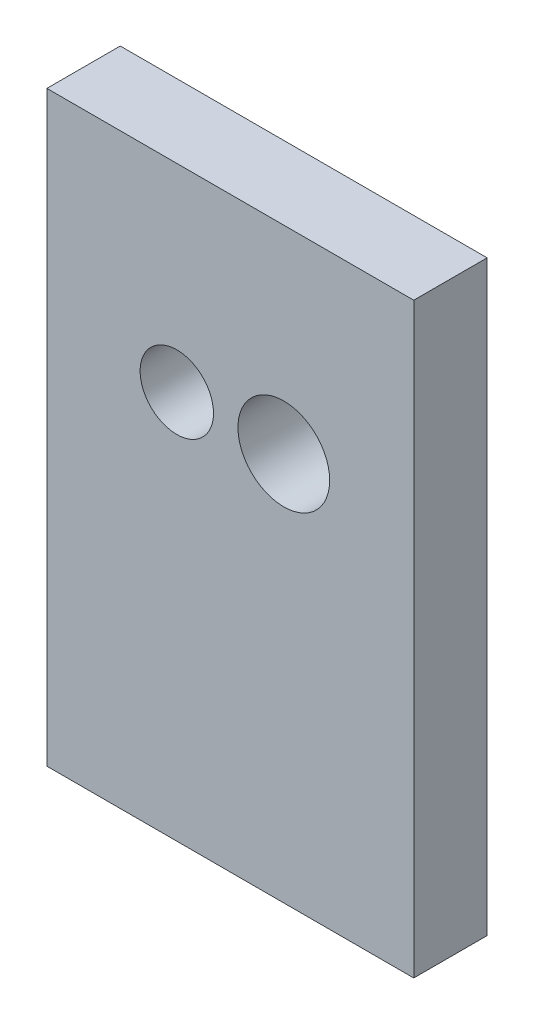
ISO-10303-21;
HEADER;
FILE_DESCRIPTION(('STEP AP214'),'2;1');
FILE_NAME('part.step','',(''),(''),'','','');
FILE_SCHEMA(('AUTOMOTIVE_DESIGN { 1 0 10303 214 1 1 1 1 }'));
ENDSEC;
DATA;
#1=APPLICATION_CONTEXT('core data for automotive mechanical design processes');
#2=APPLICATION_PROTOCOL_DEFINITION('international standard','automotive_design',2000,#1);
#3=PRODUCT_CONTEXT('',#1,'mechanical');
#4=PRODUCT('Part','Part','',(#3));
#5=PRODUCT_RELATED_PRODUCT_CATEGORY('part','',(#4));
#6=PRODUCT_DEFINITION_FORMATION('','',#4);
#7=PRODUCT_DEFINITION_CONTEXT('part definition',#1,'design');
#8=PRODUCT_DEFINITION('design','',#6,#7);
#9=PRODUCT_DEFINITION_SHAPE('','',#8);
#10=(LENGTH_UNIT() NAMED_UNIT(*) SI_UNIT(.MILLI.,.METRE.));
#11=(NAMED_UNIT(*) PLANE_ANGLE_UNIT() SI_UNIT($,.RADIAN.));
#12=(NAMED_UNIT(*) SI_UNIT($,.STERADIAN.) SOLID_ANGLE_UNIT());
#13=UNCERTAINTY_MEASURE_WITH_UNIT(LENGTH_MEASURE(1.E-05),#10,'distance_accuracy_value','');
#14=(GEOMETRIC_REPRESENTATION_CONTEXT(3) GLOBAL_UNCERTAINTY_ASSIGNED_CONTEXT((#13)) GLOBAL_UNIT_ASSIGNED_CONTEXT((#10,
#11,#12)) REPRESENTATION_CONTEXT('',''));
#15=CARTESIAN_POINT('',(0.,0.,0.));
#16=DIRECTION('',(0.,0.,1.));
#17=DIRECTION('',(1.,0.,0.));
#18=AXIS2_PLACEMENT_3D('',#15,#16,#17);
#19=CARTESIAN_POINT('',(31.75,0.,12.7));
#20=DIRECTION('',(1.,0.,0.));
#21=DIRECTION('',(0.,1.,0.));
#22=AXIS2_PLACEMENT_3D('',#19,#20,#21);
#23=PLANE('',#22);
#24=DIRECTION('',(0.,0.,1.));
#25=VECTOR('',#24,1.);
#26=CARTESIAN_POINT('',(31.75,34.29,0.));
#27=LINE('',#26,#25);
#28=CARTESIAN_POINT('',(31.75,34.29,0.));
#29=VERTEX_POINT('',#28);
#30=CARTESIAN_POINT('',(31.75,34.29,12.7));
#31=VERTEX_POINT('',#30);
#32=EDGE_CURVE('E50',#29,#31,#27,.T.);
#33=ORIENTED_EDGE('',*,*,#32,.T.);
#34=DIRECTION('',(0.,-1.,0.));
#35=VECTOR('',#34,1.);
#36=CARTESIAN_POINT('',(31.75,0.,12.7));
#37=LINE('',#36,#35);
#38=CARTESIAN_POINT('',(31.75,-67.31,12.7));
#39=VERTEX_POINT('',#38);
#40=EDGE_CURVE('E58',#31,#39,#37,.T.);
#41=ORIENTED_EDGE('',*,*,#40,.T.);
#42=DIRECTION('',(0.,0.,-1.));
#43=VECTOR('',#42,1.);
#44=CARTESIAN_POINT('',(31.75,-67.31,12.7));
#45=LINE('',#44,#43);
#46=CARTESIAN_POINT('',(31.75,-67.31,0.));
#47=VERTEX_POINT('',#46);
#48=EDGE_CURVE('E43',#39,#47,#45,.T.);
#49=ORIENTED_EDGE('',*,*,#48,.T.);
#50=DIRECTION('',(0.,-1.,0.));
#51=VECTOR('',#50,1.);
#52=CARTESIAN_POINT('',(31.75,0.,0.));
#53=LINE('',#52,#51);
#54=EDGE_CURVE('E72',#29,#47,#53,.T.);
#55=ORIENTED_EDGE('',*,*,#54,.F.);
#56=EDGE_LOOP('',(#33,#41,#49,#55));
#57=FACE_BOUND('',#56,.T.);
#58=ADVANCED_FACE('F35',(#57),#23,.T.);
#59=CARTESIAN_POINT('',(-31.75,0.,12.7));
#60=DIRECTION('',(1.,0.,0.));
#61=DIRECTION('',(0.,1.,0.));
#62=AXIS2_PLACEMENT_3D('',#59,#60,#61);
#63=PLANE('',#62);
#64=DIRECTION('',(0.,-1.,0.));
#65=VECTOR('',#64,1.);
#66=CARTESIAN_POINT('',(-31.75,0.,12.7));
#67=LINE('',#66,#65);
#68=CARTESIAN_POINT('',(-31.75,34.29,12.7));
#69=VERTEX_POINT('',#68);
#70=CARTESIAN_POINT('',(-31.75,-67.31,12.7));
#71=VERTEX_POINT('',#70);
#72=EDGE_CURVE('E100',#69,#71,#67,.T.);
#73=ORIENTED_EDGE('',*,*,#72,.F.);
#74=DIRECTION('',(0.,0.,1.));
#75=VECTOR('',#74,1.);
#76=CARTESIAN_POINT('',(-31.75,34.29,0.));
#77=LINE('',#76,#75);
#78=CARTESIAN_POINT('',(-31.75,34.29,0.));
#79=VERTEX_POINT('',#78);
#80=EDGE_CURVE('E105',#79,#69,#77,.T.);
#81=ORIENTED_EDGE('',*,*,#80,.F.);
#82=DIRECTION('',(0.,-1.,0.));
#83=VECTOR('',#82,1.);
#84=CARTESIAN_POINT('',(-31.75,0.,0.));
#85=LINE('',#84,#83);
#86=CARTESIAN_POINT('',(-31.75,-67.31,0.));
#87=VERTEX_POINT('',#86);
#88=EDGE_CURVE('E78',#79,#87,#85,.T.);
#89=ORIENTED_EDGE('',*,*,#88,.T.);
#90=DIRECTION('',(0.,0.,-1.));
#91=VECTOR('',#90,1.);
#92=CARTESIAN_POINT('',(-31.75,-67.31,12.7));
#93=LINE('',#92,#91);
#94=EDGE_CURVE('E11',#71,#87,#93,.T.);
#95=ORIENTED_EDGE('',*,*,#94,.F.);
#96=EDGE_LOOP('',(#73,#81,#89,#95));
#97=FACE_BOUND('',#96,.T.);
#98=ADVANCED_FACE('F121',(#97),#63,.F.);
#99=CARTESIAN_POINT('',(-9.26084,0.,12.7));
#100=DIRECTION('',(0.,0.,-1.));
#101=DIRECTION('',(-1.,0.,0.));
#102=AXIS2_PLACEMENT_3D('',#99,#100,#101);
#103=CYLINDRICAL_SURFACE('',#102,6.35);
#104=CARTESIAN_POINT('',(-9.26084,0.,12.7));
#105=DIRECTION('',(0.,0.,1.));
#106=DIRECTION('',(1.,0.,0.));
#107=AXIS2_PLACEMENT_3D('',#104,#105,#106);
#108=CIRCLE('',#107,6.35);
#109=CARTESIAN_POINT('',(-2.91084,0.,12.7));
#110=VERTEX_POINT('',#109);
#111=EDGE_CURVE('E90',#110,#110,#108,.T.);
#112=ORIENTED_EDGE('',*,*,#111,.T.);
#113=EDGE_LOOP('',(#112));
#114=FACE_BOUND('',#113,.T.);
#115=CARTESIAN_POINT('',(-9.26084,0.,0.));
#116=DIRECTION('',(0.,0.,1.));
#117=DIRECTION('',(1.,0.,0.));
#118=AXIS2_PLACEMENT_3D('',#115,#116,#117);
#119=CIRCLE('',#118,6.35);
#120=CARTESIAN_POINT('',(-2.91084,0.,0.));
#121=VERTEX_POINT('',#120);
#122=EDGE_CURVE('E79',#121,#121,#119,.T.);
#123=ORIENTED_EDGE('',*,*,#122,.F.);
#124=EDGE_LOOP('',(#123));
#125=FACE_BOUND('',#124,.T.);
#126=ADVANCED_FACE('F125',(#114,#125),#103,.F.);
#127=CARTESIAN_POINT('',(9.26084,0.,12.7));
#128=DIRECTION('',(0.,0.,-1.));
#129=DIRECTION('',(-1.,0.,0.));
#130=AXIS2_PLACEMENT_3D('',#127,#128,#129);
#131=CYLINDRICAL_SURFACE('',#130,7.93750000000001);
#132=CARTESIAN_POINT('',(9.26084,0.,12.7));
#133=DIRECTION('',(0.,0.,1.));
#134=DIRECTION('',(1.,0.,0.));
#135=AXIS2_PLACEMENT_3D('',#132,#133,#134);
#136=CIRCLE('',#135,7.93750000000001);
#137=CARTESIAN_POINT('',(17.19834,0.,12.7));
#138=VERTEX_POINT('',#137);
#139=EDGE_CURVE('E87',#138,#138,#136,.T.);
#140=ORIENTED_EDGE('',*,*,#139,.T.);
#141=EDGE_LOOP('',(#140));
#142=FACE_BOUND('',#141,.T.);
#143=CARTESIAN_POINT('',(9.26084,0.,0.));
#144=DIRECTION('',(0.,0.,1.));
#145=DIRECTION('',(1.,0.,0.));
#146=AXIS2_PLACEMENT_3D('',#143,#144,#145);
#147=CIRCLE('',#146,7.93750000000001);
#148=CARTESIAN_POINT('',(17.19834,0.,0.));
#149=VERTEX_POINT('',#148);
#150=EDGE_CURVE('E96',#149,#149,#147,.T.);
#151=ORIENTED_EDGE('',*,*,#150,.F.);
#152=EDGE_LOOP('',(#151));
#153=FACE_BOUND('',#152,.T.);
#154=ADVANCED_FACE('F37',(#142,#153),#131,.F.);
#155=CARTESIAN_POINT('',(0.,-67.31,12.7));
#156=DIRECTION('',(0.,1.,0.));
#157=DIRECTION('',(0.,0.,1.));
#158=AXIS2_PLACEMENT_3D('',#155,#156,#157);
#159=PLANE('',#158);
#160=DIRECTION('',(1.,0.,0.));
#161=VECTOR('',#160,1.);
#162=CARTESIAN_POINT('',(0.,-67.31,0.));
#163=LINE('',#162,#161);
#164=EDGE_CURVE('E76',#87,#47,#163,.T.);
#165=ORIENTED_EDGE('',*,*,#164,.T.);
#166=ORIENTED_EDGE('',*,*,#48,.F.);
#167=DIRECTION('',(1.,0.,0.));
#168=VECTOR('',#167,1.);
#169=CARTESIAN_POINT('',(0.,-67.31,12.7));
#170=LINE('',#169,#168);
#171=EDGE_CURVE('E84',#71,#39,#170,.T.);
#172=ORIENTED_EDGE('',*,*,#171,.F.);
#173=ORIENTED_EDGE('',*,*,#94,.T.);
#174=EDGE_LOOP('',(#165,#166,#172,#173));
#175=FACE_BOUND('',#174,.T.);
#176=ADVANCED_FACE('F85',(#175),#159,.F.);
#177=CARTESIAN_POINT('',(0.,0.,12.7));
#178=DIRECTION('',(0.,0.,1.));
#179=DIRECTION('',(1.,0.,0.));
#180=AXIS2_PLACEMENT_3D('',#177,#178,#179);
#181=PLANE('',#180);
#182=DIRECTION('',(1.,0.,0.));
#183=VECTOR('',#182,1.);
#184=CARTESIAN_POINT('',(-31.75,34.29,12.7));
#185=LINE('',#184,#183);
#186=EDGE_CURVE('E109',#69,#31,#185,.T.);
#187=ORIENTED_EDGE('',*,*,#186,.F.);
#188=ORIENTED_EDGE('',*,*,#72,.T.);
#189=ORIENTED_EDGE('',*,*,#171,.T.);
#190=ORIENTED_EDGE('',*,*,#40,.F.);
#191=EDGE_LOOP('',(#187,#188,#189,#190));
#192=FACE_BOUND('',#191,.T.);
#193=ORIENTED_EDGE('',*,*,#139,.F.);
#194=EDGE_LOOP('',(#193));
#195=FACE_BOUND('',#194,.T.);
#196=ORIENTED_EDGE('',*,*,#111,.F.);
#197=EDGE_LOOP('',(#196));
#198=FACE_BOUND('',#197,.T.);
#199=ADVANCED_FACE('F118',(#192,#195,#198),#181,.T.);
#200=CARTESIAN_POINT('',(0.,0.,0.));
#201=DIRECTION('',(0.,0.,1.));
#202=DIRECTION('',(1.,0.,0.));
#203=AXIS2_PLACEMENT_3D('',#200,#201,#202);
#204=PLANE('',#203);
#205=ORIENTED_EDGE('',*,*,#150,.T.);
#206=EDGE_LOOP('',(#205));
#207=FACE_BOUND('',#206,.T.);
#208=ORIENTED_EDGE('',*,*,#122,.T.);
#209=EDGE_LOOP('',(#208));
#210=FACE_BOUND('',#209,.T.);
#211=ORIENTED_EDGE('',*,*,#88,.F.);
#212=DIRECTION('',(1.,0.,0.));
#213=VECTOR('',#212,1.);
#214=CARTESIAN_POINT('',(-31.75,34.29,0.));
#215=LINE('',#214,#213);
#216=EDGE_CURVE('E77',#79,#29,#215,.T.);
#217=ORIENTED_EDGE('',*,*,#216,.T.);
#218=ORIENTED_EDGE('',*,*,#54,.T.);
#219=ORIENTED_EDGE('',*,*,#164,.F.);
#220=EDGE_LOOP('',(#211,#217,#218,#219));
#221=FACE_BOUND('',#220,.T.);
#222=ADVANCED_FACE('F74',(#207,#210,#221),#204,.F.);
#223=CARTESIAN_POINT('',(-31.75,34.29,0.));
#224=DIRECTION('',(0.,-1.,0.));
#225=DIRECTION('',(1.,0.,0.));
#226=AXIS2_PLACEMENT_3D('',#223,#224,#225);
#227=PLANE('',#226);
#228=ORIENTED_EDGE('',*,*,#186,.T.);
#229=ORIENTED_EDGE('',*,*,#32,.F.);
#230=ORIENTED_EDGE('',*,*,#216,.F.);
#231=ORIENTED_EDGE('',*,*,#80,.T.);
#232=EDGE_LOOP('',(#228,#229,#230,#231));
#233=FACE_BOUND('',#232,.T.);
#234=ADVANCED_FACE('F113',(#233),#227,.F.);
#235=CLOSED_SHELL('',(#58,#98,#126,#154,#176,#199,#222,#234));
#236=MANIFOLD_SOLID_BREP('B2',#235);
#237=ADVANCED_BREP_SHAPE_REPRESENTATION('',(#18,#236),#14);
#238=SHAPE_DEFINITION_REPRESENTATION(#9,#237);
ENDSEC;
END-ISO-10303-21;
